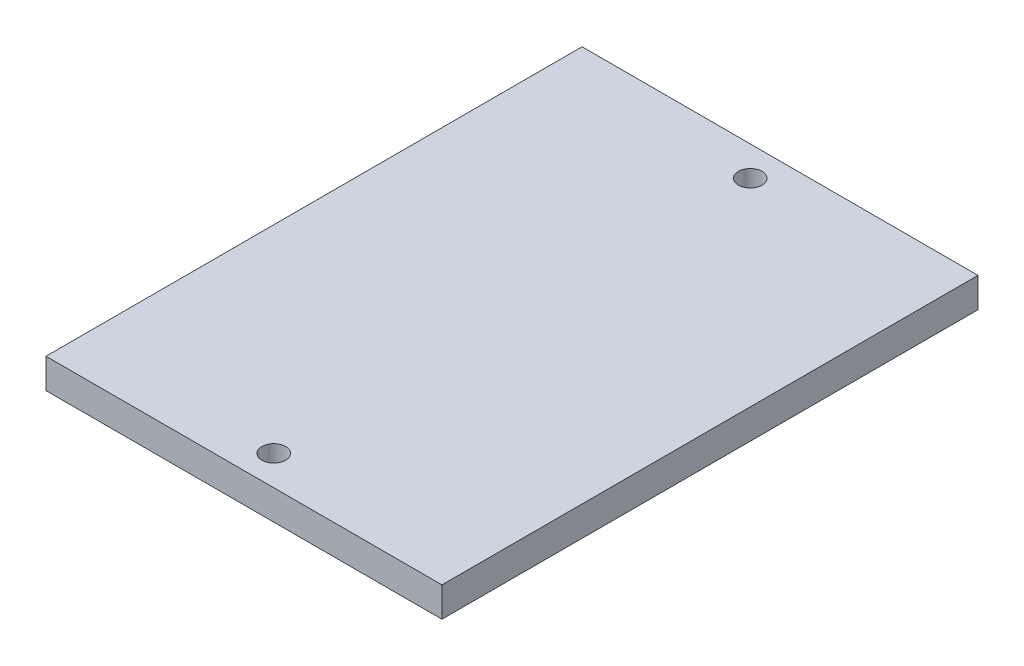
ISO-10303-21;
HEADER;
FILE_DESCRIPTION(('STEP AP214'),'2;1');
FILE_NAME('part.step','',(''),(''),'','','');
FILE_SCHEMA(('AUTOMOTIVE_DESIGN { 1 0 10303 214 1 1 1 1 }'));
ENDSEC;
DATA;
#1=APPLICATION_CONTEXT('core data for automotive mechanical design processes');
#2=APPLICATION_PROTOCOL_DEFINITION('international standard','automotive_design',2000,#1);
#3=PRODUCT_CONTEXT('',#1,'mechanical');
#4=PRODUCT('Part','Part','',(#3));
#5=PRODUCT_RELATED_PRODUCT_CATEGORY('part','',(#4));
#6=PRODUCT_DEFINITION_FORMATION('','',#4);
#7=PRODUCT_DEFINITION_CONTEXT('part definition',#1,'design');
#8=PRODUCT_DEFINITION('design','',#6,#7);
#9=PRODUCT_DEFINITION_SHAPE('','',#8);
#10=(LENGTH_UNIT() NAMED_UNIT(*) SI_UNIT(.MILLI.,.METRE.));
#11=(NAMED_UNIT(*) PLANE_ANGLE_UNIT() SI_UNIT($,.RADIAN.));
#12=(NAMED_UNIT(*) SI_UNIT($,.STERADIAN.) SOLID_ANGLE_UNIT());
#13=UNCERTAINTY_MEASURE_WITH_UNIT(LENGTH_MEASURE(1.E-05),#10,'distance_accuracy_value','');
#14=(GEOMETRIC_REPRESENTATION_CONTEXT(3) GLOBAL_UNCERTAINTY_ASSIGNED_CONTEXT((#13)) GLOBAL_UNIT_ASSIGNED_CONTEXT((#10,
#11,#12)) REPRESENTATION_CONTEXT('',''));
#15=CARTESIAN_POINT('',(0.,0.,0.));
#16=DIRECTION('',(0.,0.,1.));
#17=DIRECTION('',(1.,0.,0.));
#18=AXIS2_PLACEMENT_3D('',#15,#16,#17);
#19=CARTESIAN_POINT('',(42.21315,6.35,57.15));
#20=DIRECTION('',(-1.,0.,0.));
#21=DIRECTION('',(0.,0.,1.));
#22=AXIS2_PLACEMENT_3D('',#19,#20,#21);
#23=PLANE('',#22);
#24=DIRECTION('',(0.,0.,-1.));
#25=VECTOR('',#24,1.);
#26=CARTESIAN_POINT('',(42.21315,0.,57.15));
#27=LINE('',#26,#25);
#28=CARTESIAN_POINT('',(42.21315,0.,57.15));
#29=VERTEX_POINT('',#28);
#30=CARTESIAN_POINT('',(42.21315,0.,-57.15));
#31=VERTEX_POINT('',#30);
#32=EDGE_CURVE('E114',#29,#31,#27,.T.);
#33=ORIENTED_EDGE('',*,*,#32,.T.);
#34=DIRECTION('',(0.,-1.,0.));
#35=VECTOR('',#34,1.);
#36=CARTESIAN_POINT('',(42.21315,6.35,-57.15));
#37=LINE('',#36,#35);
#38=CARTESIAN_POINT('',(42.21315,6.35,-57.15));
#39=VERTEX_POINT('',#38);
#40=EDGE_CURVE('E11',#39,#31,#37,.T.);
#41=ORIENTED_EDGE('',*,*,#40,.F.);
#42=DIRECTION('',(0.,0.,-1.));
#43=VECTOR('',#42,1.);
#44=CARTESIAN_POINT('',(42.21315,6.35,57.15));
#45=LINE('',#44,#43);
#46=CARTESIAN_POINT('',(42.21315,6.35,57.15));
#47=VERTEX_POINT('',#46);
#48=EDGE_CURVE('E97',#47,#39,#45,.T.);
#49=ORIENTED_EDGE('',*,*,#48,.F.);
#50=DIRECTION('',(0.,-1.,0.));
#51=VECTOR('',#50,1.);
#52=CARTESIAN_POINT('',(42.21315,6.35,57.15));
#53=LINE('',#52,#51);
#54=EDGE_CURVE('E110',#47,#29,#53,.T.);
#55=ORIENTED_EDGE('',*,*,#54,.T.);
#56=EDGE_LOOP('',(#33,#41,#49,#55));
#57=FACE_BOUND('',#56,.T.);
#58=ADVANCED_FACE('F43',(#57),#23,.F.);
#59=CARTESIAN_POINT('',(-42.21315,6.35,-57.15));
#60=DIRECTION('',(0.,0.,1.));
#61=DIRECTION('',(1.,0.,0.));
#62=AXIS2_PLACEMENT_3D('',#59,#60,#61);
#63=PLANE('',#62);
#64=DIRECTION('',(-1.,0.,0.));
#65=VECTOR('',#64,1.);
#66=CARTESIAN_POINT('',(-42.21315,0.,-57.15));
#67=LINE('',#66,#65);
#68=CARTESIAN_POINT('',(-42.21315,0.,-57.15));
#69=VERTEX_POINT('',#68);
#70=EDGE_CURVE('E102',#31,#69,#67,.T.);
#71=ORIENTED_EDGE('',*,*,#70,.T.);
#72=DIRECTION('',(0.,-1.,0.));
#73=VECTOR('',#72,1.);
#74=CARTESIAN_POINT('',(-42.21315,6.35,-57.15));
#75=LINE('',#74,#73);
#76=CARTESIAN_POINT('',(-42.21315,6.35,-57.15));
#77=VERTEX_POINT('',#76);
#78=EDGE_CURVE('E53',#77,#69,#75,.T.);
#79=ORIENTED_EDGE('',*,*,#78,.F.);
#80=DIRECTION('',(-1.,0.,0.));
#81=VECTOR('',#80,1.);
#82=CARTESIAN_POINT('',(-42.21315,6.35,-57.15));
#83=LINE('',#82,#81);
#84=EDGE_CURVE('E92',#39,#77,#83,.T.);
#85=ORIENTED_EDGE('',*,*,#84,.F.);
#86=ORIENTED_EDGE('',*,*,#40,.T.);
#87=EDGE_LOOP('',(#71,#79,#85,#86));
#88=FACE_BOUND('',#87,.T.);
#89=ADVANCED_FACE('F101',(#88),#63,.F.);
#90=CARTESIAN_POINT('',(-42.21315,6.35,57.15));
#91=DIRECTION('',(1.,0.,0.));
#92=DIRECTION('',(0.,0.,-1.));
#93=AXIS2_PLACEMENT_3D('',#90,#91,#92);
#94=PLANE('',#93);
#95=DIRECTION('',(0.,0.,1.));
#96=VECTOR('',#95,1.);
#97=CARTESIAN_POINT('',(-42.21315,0.,57.15));
#98=LINE('',#97,#96);
#99=CARTESIAN_POINT('',(-42.21315,0.,57.15));
#100=VERTEX_POINT('',#99);
#101=EDGE_CURVE('E79',#69,#100,#98,.T.);
#102=ORIENTED_EDGE('',*,*,#101,.T.);
#103=DIRECTION('',(0.,-1.,0.));
#104=VECTOR('',#103,1.);
#105=CARTESIAN_POINT('',(-42.21315,6.35,57.15));
#106=LINE('',#105,#104);
#107=CARTESIAN_POINT('',(-42.21315,6.35,57.15));
#108=VERTEX_POINT('',#107);
#109=EDGE_CURVE('E104',#108,#100,#106,.T.);
#110=ORIENTED_EDGE('',*,*,#109,.F.);
#111=DIRECTION('',(0.,0.,1.));
#112=VECTOR('',#111,1.);
#113=CARTESIAN_POINT('',(-42.21315,6.35,57.15));
#114=LINE('',#113,#112);
#115=EDGE_CURVE('E95',#77,#108,#114,.T.);
#116=ORIENTED_EDGE('',*,*,#115,.F.);
#117=ORIENTED_EDGE('',*,*,#78,.T.);
#118=EDGE_LOOP('',(#102,#110,#116,#117));
#119=FACE_BOUND('',#118,.T.);
#120=ADVANCED_FACE('F106',(#119),#94,.F.);
#121=CARTESIAN_POINT('',(-42.21315,6.35,57.15));
#122=DIRECTION('',(0.,0.,-1.));
#123=DIRECTION('',(-1.,0.,0.));
#124=AXIS2_PLACEMENT_3D('',#121,#122,#123);
#125=PLANE('',#124);
#126=DIRECTION('',(1.,0.,0.));
#127=VECTOR('',#126,1.);
#128=CARTESIAN_POINT('',(-42.21315,0.,57.15));
#129=LINE('',#128,#127);
#130=EDGE_CURVE('E85',#100,#29,#129,.T.);
#131=ORIENTED_EDGE('',*,*,#130,.T.);
#132=ORIENTED_EDGE('',*,*,#54,.F.);
#133=DIRECTION('',(1.,0.,0.));
#134=VECTOR('',#133,1.);
#135=CARTESIAN_POINT('',(-42.21315,6.35,57.15));
#136=LINE('',#135,#134);
#137=EDGE_CURVE('E62',#108,#47,#136,.T.);
#138=ORIENTED_EDGE('',*,*,#137,.F.);
#139=ORIENTED_EDGE('',*,*,#109,.T.);
#140=EDGE_LOOP('',(#131,#132,#138,#139));
#141=FACE_BOUND('',#140,.T.);
#142=ADVANCED_FACE('F151',(#141),#125,.F.);
#143=CARTESIAN_POINT('',(0.,6.35,0.));
#144=DIRECTION('',(0.,-1.,0.));
#145=DIRECTION('',(0.,0.,-1.));
#146=AXIS2_PLACEMENT_3D('',#143,#144,#145);
#147=PLANE('',#146);
#148=CARTESIAN_POINT('',(0.,6.35,-50.8));
#149=DIRECTION('',(0.,1.,0.));
#150=DIRECTION('',(0.,0.,1.));
#151=AXIS2_PLACEMENT_3D('',#148,#149,#150);
#152=CIRCLE('',#151,2.54);
#153=CARTESIAN_POINT('',(0.,6.35,-48.26));
#154=VERTEX_POINT('',#153);
#155=EDGE_CURVE('E130',#154,#154,#152,.T.);
#156=ORIENTED_EDGE('',*,*,#155,.F.);
#157=EDGE_LOOP('',(#156));
#158=FACE_BOUND('',#157,.T.);
#159=CARTESIAN_POINT('',(0.,6.35,50.8));
#160=DIRECTION('',(0.,1.,0.));
#161=DIRECTION('',(0.,0.,-1.));
#162=AXIS2_PLACEMENT_3D('',#159,#160,#161);
#163=CIRCLE('',#162,2.54);
#164=CARTESIAN_POINT('',(0.,6.35,53.34));
#165=VERTEX_POINT('',#164);
#166=EDGE_CURVE('E137',#165,#165,#163,.T.);
#167=ORIENTED_EDGE('',*,*,#166,.F.);
#168=EDGE_LOOP('',(#167));
#169=FACE_BOUND('',#168,.T.);
#170=ORIENTED_EDGE('',*,*,#48,.T.);
#171=ORIENTED_EDGE('',*,*,#84,.T.);
#172=ORIENTED_EDGE('',*,*,#115,.T.);
#173=ORIENTED_EDGE('',*,*,#137,.T.);
#174=EDGE_LOOP('',(#170,#171,#172,#173));
#175=FACE_BOUND('',#174,.T.);
#176=ADVANCED_FACE('F93',(#158,#169,#175),#147,.F.);
#177=CARTESIAN_POINT('',(0.,0.,0.));
#178=DIRECTION('',(0.,-1.,0.));
#179=DIRECTION('',(0.,0.,-1.));
#180=AXIS2_PLACEMENT_3D('',#177,#178,#179);
#181=PLANE('',#180);
#182=CARTESIAN_POINT('',(0.,0.,-50.8));
#183=DIRECTION('',(0.,-1.,0.));
#184=DIRECTION('',(0.,0.,-1.));
#185=AXIS2_PLACEMENT_3D('',#182,#183,#184);
#186=CIRCLE('',#185,2.54);
#187=CARTESIAN_POINT('',(0.,0.,-48.26));
#188=VERTEX_POINT('',#187);
#189=EDGE_CURVE('E46',#188,#188,#186,.T.);
#190=ORIENTED_EDGE('',*,*,#189,.F.);
#191=EDGE_LOOP('',(#190));
#192=FACE_BOUND('',#191,.T.);
#193=CARTESIAN_POINT('',(0.,0.,50.8));
#194=DIRECTION('',(0.,-1.,0.));
#195=DIRECTION('',(0.,0.,-1.));
#196=AXIS2_PLACEMENT_3D('',#193,#194,#195);
#197=CIRCLE('',#196,2.54);
#198=CARTESIAN_POINT('',(0.,0.,53.34));
#199=VERTEX_POINT('',#198);
#200=EDGE_CURVE('E127',#199,#199,#197,.T.);
#201=ORIENTED_EDGE('',*,*,#200,.F.);
#202=EDGE_LOOP('',(#201));
#203=FACE_BOUND('',#202,.T.);
#204=ORIENTED_EDGE('',*,*,#32,.F.);
#205=ORIENTED_EDGE('',*,*,#130,.F.);
#206=ORIENTED_EDGE('',*,*,#101,.F.);
#207=ORIENTED_EDGE('',*,*,#70,.F.);
#208=EDGE_LOOP('',(#204,#205,#206,#207));
#209=FACE_BOUND('',#208,.T.);
#210=ADVANCED_FACE('F150',(#192,#203,#209),#181,.T.);
#211=CARTESIAN_POINT('',(0.,-3.175,50.8));
#212=DIRECTION('',(0.,1.,0.));
#213=DIRECTION('',(0.,0.,1.));
#214=AXIS2_PLACEMENT_3D('',#211,#212,#213);
#215=CYLINDRICAL_SURFACE('',#214,2.54);
#216=CARTESIAN_POINT('',(0.,0.,53.34));
#217=CARTESIAN_POINT('',(0.,0.0661458333333336,53.34));
#218=CARTESIAN_POINT('',(0.,0.132291666666667,53.34));
#219=CARTESIAN_POINT('',(0.,0.264583333333334,53.34));
#220=CARTESIAN_POINT('',(0.,0.330729166666667,53.34));
#221=CARTESIAN_POINT('',(0.,0.463020833333334,53.34));
#222=CARTESIAN_POINT('',(0.,0.529166666666667,53.34));
#223=CARTESIAN_POINT('',(0.,0.661458333333334,53.34));
#224=CARTESIAN_POINT('',(0.,0.727604166666667,53.34));
#225=CARTESIAN_POINT('',(0.,0.859895833333333,53.34));
#226=CARTESIAN_POINT('',(0.,0.926041666666667,53.34));
#227=CARTESIAN_POINT('',(0.,1.05833333333333,53.34));
#228=CARTESIAN_POINT('',(0.,1.12447916666667,53.34));
#229=CARTESIAN_POINT('',(0.,1.25677083333333,53.34));
#230=CARTESIAN_POINT('',(0.,1.32291666666667,53.34));
#231=CARTESIAN_POINT('',(0.,1.45520833333333,53.34));
#232=CARTESIAN_POINT('',(0.,1.52135416666667,53.34));
#233=CARTESIAN_POINT('',(0.,1.65364583333333,53.34));
#234=CARTESIAN_POINT('',(0.,1.71979166666667,53.34));
#235=CARTESIAN_POINT('',(0.,1.85208333333333,53.34));
#236=CARTESIAN_POINT('',(0.,1.91822916666667,53.34));
#237=CARTESIAN_POINT('',(0.,2.05052083333333,53.34));
#238=CARTESIAN_POINT('',(0.,2.11666666666667,53.34));
#239=CARTESIAN_POINT('',(0.,2.24895833333333,53.34));
#240=CARTESIAN_POINT('',(0.,2.31510416666667,53.34));
#241=CARTESIAN_POINT('',(0.,2.44739583333333,53.34));
#242=CARTESIAN_POINT('',(0.,2.51354166666667,53.34));
#243=CARTESIAN_POINT('',(0.,2.64583333333333,53.34));
#244=CARTESIAN_POINT('',(0.,2.71197916666667,53.34));
#245=CARTESIAN_POINT('',(0.,2.84427083333333,53.34));
#246=CARTESIAN_POINT('',(0.,2.91041666666667,53.34));
#247=CARTESIAN_POINT('',(0.,3.04270833333333,53.34));
#248=CARTESIAN_POINT('',(0.,3.10885416666667,53.34));
#249=CARTESIAN_POINT('',(0.,3.24114583333333,53.34));
#250=CARTESIAN_POINT('',(0.,3.30729166666667,53.34));
#251=CARTESIAN_POINT('',(0.,3.43958333333333,53.34));
#252=CARTESIAN_POINT('',(0.,3.50572916666667,53.34));
#253=CARTESIAN_POINT('',(0.,3.63802083333333,53.34));
#254=CARTESIAN_POINT('',(0.,3.70416666666667,53.34));
#255=CARTESIAN_POINT('',(0.,3.83645833333333,53.34));
#256=CARTESIAN_POINT('',(0.,3.90260416666667,53.34));
#257=CARTESIAN_POINT('',(0.,4.03489583333333,53.34));
#258=CARTESIAN_POINT('',(0.,4.10104166666667,53.34));
#259=CARTESIAN_POINT('',(0.,4.23333333333333,53.34));
#260=CARTESIAN_POINT('',(0.,4.29947916666667,53.34));
#261=CARTESIAN_POINT('',(0.,4.43177083333333,53.34));
#262=CARTESIAN_POINT('',(0.,4.49791666666667,53.34));
#263=CARTESIAN_POINT('',(0.,4.63020833333333,53.34));
#264=CARTESIAN_POINT('',(0.,4.69635416666667,53.34));
#265=CARTESIAN_POINT('',(0.,4.82864583333333,53.34));
#266=CARTESIAN_POINT('',(0.,4.89479166666667,53.34));
#267=CARTESIAN_POINT('',(0.,5.02708333333333,53.34));
#268=CARTESIAN_POINT('',(0.,5.09322916666667,53.34));
#269=CARTESIAN_POINT('',(0.,5.22552083333333,53.34));
#270=CARTESIAN_POINT('',(0.,5.29166666666667,53.34));
#271=CARTESIAN_POINT('',(0.,5.42395833333333,53.34));
#272=CARTESIAN_POINT('',(0.,5.49010416666667,53.34));
#273=CARTESIAN_POINT('',(0.,5.62239583333333,53.34));
#274=CARTESIAN_POINT('',(0.,5.68854166666667,53.34));
#275=CARTESIAN_POINT('',(0.,5.82083333333333,53.34));
#276=CARTESIAN_POINT('',(0.,5.88697916666667,53.34));
#277=CARTESIAN_POINT('',(0.,6.01927083333333,53.34));
#278=CARTESIAN_POINT('',(0.,6.08541666666667,53.34));
#279=CARTESIAN_POINT('',(0.,6.21770833333333,53.34));
#280=CARTESIAN_POINT('',(0.,6.28385416666667,53.34));
#281=CARTESIAN_POINT('',(0.,6.35,53.34));
#282=B_SPLINE_CURVE_WITH_KNOTS('',3,(#216,#217,#218,#219,#220,#221,#222,#223,#224,#225,#226,
#227,#228,#229,#230,#231,#232,#233,#234,#235,#236,#237,#238,#239,#240,#241,#242,#243,#244,#245,
#246,#247,#248,#249,#250,#251,#252,#253,#254,#255,#256,#257,#258,#259,#260,#261,#262,#263,#264,
#265,#266,#267,#268,#269,#270,#271,#272,#273,#274,#275,#276,#277,#278,#279,#280,#281),
.UNSPECIFIED.,.F.,.F.,(4,2,2,2,2,2,2,2,2,2,2,2,2,2,2,2,2,2,2,2,2,2,2,2,2,2,2,2,2,2,2,2,4),(0.,
0.1984375,0.396875,0.5953125,0.79375,0.9921875,1.190625,1.3890625,1.5875,1.7859375,1.984375,
2.1828125,2.38125,2.5796875,2.778125,2.9765625,3.175,3.3734375,3.571875,3.7703125,3.96875,
4.1671875,4.365625,4.5640625,4.7625,4.9609375,5.159375,5.3578125,5.55625,5.7546875,5.953125,
6.1515625,6.35),.UNSPECIFIED.);
#283=EDGE_CURVE('BSEAM147',#199,#165,#282,.T.);
#284=ORIENTED_EDGE('',*,*,#200,.T.);
#285=ORIENTED_EDGE('',*,*,#166,.T.);
#286=ORIENTED_EDGE('',*,*,#283,.T.);
#287=ORIENTED_EDGE('',*,*,#283,.F.);
#288=EDGE_LOOP('',(#284,#286,#285,#287));
#289=FACE_BOUND('',#288,.T.);
#290=ADVANCED_FACE('F147',(#289),#215,.F.);
#291=CARTESIAN_POINT('',(0.,-3.175,-50.8));
#292=DIRECTION('',(0.,1.,0.));
#293=DIRECTION('',(0.,0.,1.));
#294=AXIS2_PLACEMENT_3D('',#291,#292,#293);
#295=CYLINDRICAL_SURFACE('',#294,2.54);
#296=CARTESIAN_POINT('',(0.,0.,-48.26));
#297=CARTESIAN_POINT('',(0.,0.0661458333333336,-48.26));
#298=CARTESIAN_POINT('',(0.,0.132291666666667,-48.26));
#299=CARTESIAN_POINT('',(0.,0.264583333333334,-48.26));
#300=CARTESIAN_POINT('',(0.,0.330729166666667,-48.26));
#301=CARTESIAN_POINT('',(0.,0.463020833333334,-48.26));
#302=CARTESIAN_POINT('',(0.,0.529166666666667,-48.26));
#303=CARTESIAN_POINT('',(0.,0.661458333333334,-48.26));
#304=CARTESIAN_POINT('',(0.,0.727604166666667,-48.26));
#305=CARTESIAN_POINT('',(0.,0.859895833333333,-48.26));
#306=CARTESIAN_POINT('',(0.,0.926041666666667,-48.26));
#307=CARTESIAN_POINT('',(0.,1.05833333333333,-48.26));
#308=CARTESIAN_POINT('',(0.,1.12447916666667,-48.26));
#309=CARTESIAN_POINT('',(0.,1.25677083333333,-48.26));
#310=CARTESIAN_POINT('',(0.,1.32291666666667,-48.26));
#311=CARTESIAN_POINT('',(0.,1.45520833333333,-48.26));
#312=CARTESIAN_POINT('',(0.,1.52135416666667,-48.26));
#313=CARTESIAN_POINT('',(0.,1.65364583333333,-48.26));
#314=CARTESIAN_POINT('',(0.,1.71979166666667,-48.26));
#315=CARTESIAN_POINT('',(0.,1.85208333333333,-48.26));
#316=CARTESIAN_POINT('',(0.,1.91822916666667,-48.26));
#317=CARTESIAN_POINT('',(0.,2.05052083333333,-48.26));
#318=CARTESIAN_POINT('',(0.,2.11666666666667,-48.26));
#319=CARTESIAN_POINT('',(0.,2.24895833333333,-48.26));
#320=CARTESIAN_POINT('',(0.,2.31510416666667,-48.26));
#321=CARTESIAN_POINT('',(0.,2.44739583333333,-48.26));
#322=CARTESIAN_POINT('',(0.,2.51354166666667,-48.26));
#323=CARTESIAN_POINT('',(0.,2.64583333333333,-48.26));
#324=CARTESIAN_POINT('',(0.,2.71197916666667,-48.26));
#325=CARTESIAN_POINT('',(0.,2.84427083333333,-48.26));
#326=CARTESIAN_POINT('',(0.,2.91041666666667,-48.26));
#327=CARTESIAN_POINT('',(0.,3.04270833333333,-48.26));
#328=CARTESIAN_POINT('',(0.,3.10885416666667,-48.26));
#329=CARTESIAN_POINT('',(0.,3.24114583333333,-48.26));
#330=CARTESIAN_POINT('',(0.,3.30729166666667,-48.26));
#331=CARTESIAN_POINT('',(0.,3.43958333333333,-48.26));
#332=CARTESIAN_POINT('',(0.,3.50572916666667,-48.26));
#333=CARTESIAN_POINT('',(0.,3.63802083333333,-48.26));
#334=CARTESIAN_POINT('',(0.,3.70416666666667,-48.26));
#335=CARTESIAN_POINT('',(0.,3.83645833333333,-48.26));
#336=CARTESIAN_POINT('',(0.,3.90260416666667,-48.26));
#337=CARTESIAN_POINT('',(0.,4.03489583333333,-48.26));
#338=CARTESIAN_POINT('',(0.,4.10104166666667,-48.26));
#339=CARTESIAN_POINT('',(0.,4.23333333333333,-48.26));
#340=CARTESIAN_POINT('',(0.,4.29947916666667,-48.26));
#341=CARTESIAN_POINT('',(0.,4.43177083333333,-48.26));
#342=CARTESIAN_POINT('',(0.,4.49791666666667,-48.26));
#343=CARTESIAN_POINT('',(0.,4.63020833333333,-48.26));
#344=CARTESIAN_POINT('',(0.,4.69635416666667,-48.26));
#345=CARTESIAN_POINT('',(0.,4.82864583333333,-48.26));
#346=CARTESIAN_POINT('',(0.,4.89479166666667,-48.26));
#347=CARTESIAN_POINT('',(0.,5.02708333333333,-48.26));
#348=CARTESIAN_POINT('',(0.,5.09322916666667,-48.26));
#349=CARTESIAN_POINT('',(0.,5.22552083333333,-48.26));
#350=CARTESIAN_POINT('',(0.,5.29166666666667,-48.26));
#351=CARTESIAN_POINT('',(0.,5.42395833333333,-48.26));
#352=CARTESIAN_POINT('',(0.,5.49010416666667,-48.26));
#353=CARTESIAN_POINT('',(0.,5.62239583333333,-48.26));
#354=CARTESIAN_POINT('',(0.,5.68854166666667,-48.26));
#355=CARTESIAN_POINT('',(0.,5.82083333333333,-48.26));
#356=CARTESIAN_POINT('',(0.,5.88697916666667,-48.26));
#357=CARTESIAN_POINT('',(0.,6.01927083333333,-48.26));
#358=CARTESIAN_POINT('',(0.,6.08541666666667,-48.26));
#359=CARTESIAN_POINT('',(0.,6.21770833333333,-48.26));
#360=CARTESIAN_POINT('',(0.,6.28385416666667,-48.26));
#361=CARTESIAN_POINT('',(0.,6.35,-48.26));
#362=B_SPLINE_CURVE_WITH_KNOTS('',3,(#296,#297,#298,#299,#300,#301,#302,#303,#304,#305,#306,
#307,#308,#309,#310,#311,#312,#313,#314,#315,#316,#317,#318,#319,#320,#321,#322,#323,#324,#325,
#326,#327,#328,#329,#330,#331,#332,#333,#334,#335,#336,#337,#338,#339,#340,#341,#342,#343,#344,
#345,#346,#347,#348,#349,#350,#351,#352,#353,#354,#355,#356,#357,#358,#359,#360,#361),
.UNSPECIFIED.,.F.,.F.,(4,2,2,2,2,2,2,2,2,2,2,2,2,2,2,2,2,2,2,2,2,2,2,2,2,2,2,2,2,2,2,2,4),(0.,
0.1984375,0.396875,0.5953125,0.79375,0.9921875,1.190625,1.3890625,1.5875,1.7859375,1.984375,
2.1828125,2.38125,2.5796875,2.778125,2.9765625,3.175,3.3734375,3.571875,3.7703125,3.96875,
4.1671875,4.365625,4.5640625,4.7625,4.9609375,5.159375,5.3578125,5.55625,5.7546875,5.953125,
6.1515625,6.35),.UNSPECIFIED.);
#363=EDGE_CURVE('BSEAM201',#188,#154,#362,.T.);
#364=ORIENTED_EDGE('',*,*,#189,.T.);
#365=ORIENTED_EDGE('',*,*,#155,.T.);
#366=ORIENTED_EDGE('',*,*,#363,.T.);
#367=ORIENTED_EDGE('',*,*,#363,.F.);
#368=EDGE_LOOP('',(#364,#366,#365,#367));
#369=FACE_BOUND('',#368,.T.);
#370=ADVANCED_FACE('F201',(#369),#295,.F.);
#371=CLOSED_SHELL('',(#58,#89,#120,#142,#176,#210,#290,#370));
#372=MANIFOLD_SOLID_BREP('B2',#371);
#373=ADVANCED_BREP_SHAPE_REPRESENTATION('',(#18,#372),#14);
#374=SHAPE_DEFINITION_REPRESENTATION(#9,#373);
ENDSEC;
END-ISO-10303-21;
